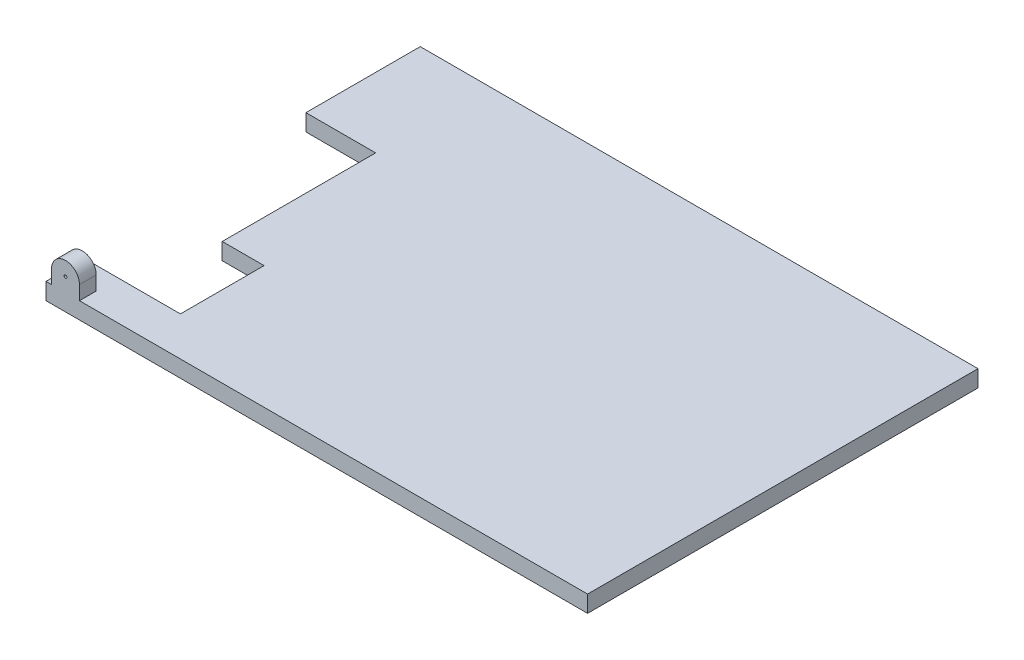
ISO-10303-21;
HEADER;
FILE_DESCRIPTION(('STEP AP214'),'2;1');
FILE_NAME('part.step','',(''),(''),'','','');
FILE_SCHEMA(('AUTOMOTIVE_DESIGN { 1 0 10303 214 1 1 1 1 }'));
ENDSEC;
DATA;
#1=APPLICATION_CONTEXT('core data for automotive mechanical design processes');
#2=APPLICATION_PROTOCOL_DEFINITION('international standard','automotive_design',2000,#1);
#3=PRODUCT_CONTEXT('',#1,'mechanical');
#4=PRODUCT('Part','Part','',(#3));
#5=PRODUCT_RELATED_PRODUCT_CATEGORY('part','',(#4));
#6=PRODUCT_DEFINITION_FORMATION('','',#4);
#7=PRODUCT_DEFINITION_CONTEXT('part definition',#1,'design');
#8=PRODUCT_DEFINITION('design','',#6,#7);
#9=PRODUCT_DEFINITION_SHAPE('','',#8);
#10=(LENGTH_UNIT() NAMED_UNIT(*) SI_UNIT(.MILLI.,.METRE.));
#11=(NAMED_UNIT(*) PLANE_ANGLE_UNIT() SI_UNIT($,.RADIAN.));
#12=(NAMED_UNIT(*) SI_UNIT($,.STERADIAN.) SOLID_ANGLE_UNIT());
#13=UNCERTAINTY_MEASURE_WITH_UNIT(LENGTH_MEASURE(1.E-05),#10,'distance_accuracy_value','');
#14=(GEOMETRIC_REPRESENTATION_CONTEXT(3) GLOBAL_UNCERTAINTY_ASSIGNED_CONTEXT((#13)) GLOBAL_UNIT_ASSIGNED_CONTEXT((#10,
#11,#12)) REPRESENTATION_CONTEXT('',''));
#15=CARTESIAN_POINT('',(0.,0.,0.));
#16=DIRECTION('',(0.,0.,1.));
#17=DIRECTION('',(1.,0.,0.));
#18=AXIS2_PLACEMENT_3D('',#15,#16,#17);
#19=CARTESIAN_POINT('',(40.,6.,-18.7966927474291));
#20=DIRECTION('',(1.,0.,0.));
#21=DIRECTION('',(0.,0.,-1.));
#22=AXIS2_PLACEMENT_3D('',#19,#20,#21);
#23=PLANE('',#22);
#24=DIRECTION('',(0.,0.,1.));
#25=VECTOR('',#24,1.);
#26=CARTESIAN_POINT('',(40.,0.,-18.7966927474291));
#27=LINE('',#26,#25);
#28=CARTESIAN_POINT('',(40.,0.,-48.7966927474291));
#29=VERTEX_POINT('',#28);
#30=CARTESIAN_POINT('',(40.,0.,-18.7966927474291));
#31=VERTEX_POINT('',#30);
#32=EDGE_CURVE('E155',#29,#31,#27,.T.);
#33=ORIENTED_EDGE('',*,*,#32,.T.);
#34=DIRECTION('',(0.,-1.,0.));
#35=VECTOR('',#34,1.);
#36=CARTESIAN_POINT('',(40.,6.,-18.7966927474291));
#37=LINE('',#36,#35);
#38=CARTESIAN_POINT('',(40.,6.,-18.7966927474291));
#39=VERTEX_POINT('',#38);
#40=EDGE_CURVE('E11',#39,#31,#37,.T.);
#41=ORIENTED_EDGE('',*,*,#40,.F.);
#42=DIRECTION('',(0.,0.,1.));
#43=VECTOR('',#42,1.);
#44=CARTESIAN_POINT('',(40.,6.,-18.7966927474291));
#45=LINE('',#44,#43);
#46=CARTESIAN_POINT('',(40.,6.,-48.7966927474291));
#47=VERTEX_POINT('',#46);
#48=EDGE_CURVE('E176',#47,#39,#45,.T.);
#49=ORIENTED_EDGE('',*,*,#48,.F.);
#50=DIRECTION('',(0.,-1.,0.));
#51=VECTOR('',#50,1.);
#52=CARTESIAN_POINT('',(40.,6.,-48.7966927474291));
#53=LINE('',#52,#51);
#54=EDGE_CURVE('E151',#47,#29,#53,.T.);
#55=ORIENTED_EDGE('',*,*,#54,.T.);
#56=EDGE_LOOP('',(#33,#41,#49,#55));
#57=FACE_BOUND('',#56,.T.);
#58=ADVANCED_FACE('F32',(#57),#23,.F.);
#59=CARTESIAN_POINT('',(5.80436578559797,6.,-18.7966927474291));
#60=DIRECTION('',(0.,0.,1.));
#61=DIRECTION('',(1.,0.,0.));
#62=AXIS2_PLACEMENT_3D('',#59,#60,#61);
#63=PLANE('',#62);
#64=DIRECTION('',(-1.,0.,0.));
#65=VECTOR('',#64,1.);
#66=CARTESIAN_POINT('',(5.80436578559797,0.,-18.7966927474291));
#67=LINE('',#66,#65);
#68=CARTESIAN_POINT('',(5.80436578559797,0.,-18.7966927474291));
#69=VERTEX_POINT('',#68);
#70=EDGE_CURVE('E158',#31,#69,#67,.T.);
#71=ORIENTED_EDGE('',*,*,#70,.T.);
#72=DIRECTION('',(0.,-1.,0.));
#73=VECTOR('',#72,1.);
#74=CARTESIAN_POINT('',(5.80436578559797,6.,-18.7966927474291));
#75=LINE('',#74,#73);
#76=CARTESIAN_POINT('',(5.80436578559797,6.,-18.7966927474291));
#77=VERTEX_POINT('',#76);
#78=EDGE_CURVE('E40',#77,#69,#75,.T.);
#79=ORIENTED_EDGE('',*,*,#78,.F.);
#80=DIRECTION('',(-1.,0.,0.));
#81=VECTOR('',#80,1.);
#82=CARTESIAN_POINT('',(25.,6.,-18.7966927474291));
#83=LINE('',#82,#81);
#84=EDGE_CURVE('E104',#39,#77,#83,.T.);
#85=ORIENTED_EDGE('',*,*,#84,.F.);
#86=ORIENTED_EDGE('',*,*,#40,.T.);
#87=EDGE_LOOP('',(#71,#79,#85,#86));
#88=FACE_BOUND('',#87,.T.);
#89=ADVANCED_FACE('F298',(#88),#63,.F.);
#90=CARTESIAN_POINT('',(5.80436578559797,6.,-4.79669274742911));
#91=DIRECTION('',(1.,0.,0.));
#92=DIRECTION('',(0.,0.,-1.));
#93=AXIS2_PLACEMENT_3D('',#90,#91,#92);
#94=PLANE('',#93);
#95=DIRECTION('',(0.,0.,1.));
#96=VECTOR('',#95,1.);
#97=CARTESIAN_POINT('',(5.80436578559797,0.,-4.79669274742911));
#98=LINE('',#97,#96);
#99=CARTESIAN_POINT('',(5.80436578559797,0.,-4.79669274742911));
#100=VERTEX_POINT('',#99);
#101=EDGE_CURVE('E162',#69,#100,#98,.T.);
#102=ORIENTED_EDGE('',*,*,#101,.T.);
#103=DIRECTION('',(0.,-1.,0.));
#104=VECTOR('',#103,1.);
#105=CARTESIAN_POINT('',(5.80436578559797,6.,-4.79669274742911));
#106=LINE('',#105,#104);
#107=CARTESIAN_POINT('',(5.80436578559797,6.,-4.79669274742911));
#108=VERTEX_POINT('',#107);
#109=EDGE_CURVE('E189',#108,#100,#106,.T.);
#110=ORIENTED_EDGE('',*,*,#109,.F.);
#111=DIRECTION('',(0.,0.,1.));
#112=VECTOR('',#111,1.);
#113=CARTESIAN_POINT('',(5.80436578559797,6.,-10.7966927474291));
#114=LINE('',#113,#112);
#115=EDGE_CURVE('E204',#77,#108,#114,.T.);
#116=ORIENTED_EDGE('',*,*,#115,.F.);
#117=ORIENTED_EDGE('',*,*,#78,.T.);
#118=EDGE_LOOP('',(#102,#110,#116,#117));
#119=FACE_BOUND('',#118,.T.);
#120=ADVANCED_FACE('F302',(#119),#94,.F.);
#121=CARTESIAN_POINT('',(5.80436578559797,6.,-4.79669274742911));
#122=DIRECTION('',(0.,0.,-1.));
#123=DIRECTION('',(-1.,0.,0.));
#124=AXIS2_PLACEMENT_3D('',#121,#122,#123);
#125=PLANE('',#124);
#126=DIRECTION('',(1.,0.,0.));
#127=VECTOR('',#126,1.);
#128=CARTESIAN_POINT('',(5.80436578559797,0.,-4.79669274742911));
#129=LINE('',#128,#127);
#130=CARTESIAN_POINT('',(200.,0.,-4.7966927474291));
#131=VERTEX_POINT('',#130);
#132=EDGE_CURVE('E164',#100,#131,#129,.T.);
#133=ORIENTED_EDGE('',*,*,#132,.T.);
#134=DIRECTION('',(0.,-1.,0.));
#135=VECTOR('',#134,1.);
#136=CARTESIAN_POINT('',(200.,6.,-4.7966927474291));
#137=LINE('',#136,#135);
#138=CARTESIAN_POINT('',(200.,6.,-4.7966927474291));
#139=VERTEX_POINT('',#138);
#140=EDGE_CURVE('E186',#139,#131,#137,.T.);
#141=ORIENTED_EDGE('',*,*,#140,.F.);
#142=DIRECTION('',(1.,0.,0.));
#143=VECTOR('',#142,1.);
#144=CARTESIAN_POINT('',(5.80436578559797,6.,-4.79669274742911));
#145=LINE('',#144,#143);
#146=CARTESIAN_POINT('',(17.804365785598,6.,-4.79669274742911));
#147=VERTEX_POINT('',#146);
#148=EDGE_CURVE('E199',#147,#139,#145,.T.);
#149=ORIENTED_EDGE('',*,*,#148,.F.);
#150=DIRECTION('',(0.,1.,0.));
#151=VECTOR('',#150,1.);
#152=CARTESIAN_POINT('',(17.804365785598,6.,-4.79669274742911));
#153=LINE('',#152,#151);
#154=CARTESIAN_POINT('',(17.804365785598,11.,-4.79669274742911));
#155=VERTEX_POINT('',#154);
#156=EDGE_CURVE('E48',#147,#155,#153,.T.);
#157=ORIENTED_EDGE('',*,*,#156,.T.);
#158=CARTESIAN_POINT('',(12.804365785598,11.,-4.79669274742911));
#159=DIRECTION('',(0.,0.,1.));
#160=DIRECTION('',(1.,0.,0.));
#161=AXIS2_PLACEMENT_3D('',#158,#159,#160);
#162=CIRCLE('',#161,5.);
#163=CARTESIAN_POINT('',(7.80436578559797,11.,-4.79669274742911));
#164=VERTEX_POINT('',#163);
#165=EDGE_CURVE('E250',#155,#164,#162,.T.);
#166=ORIENTED_EDGE('',*,*,#165,.T.);
#167=DIRECTION('',(0.,-1.,0.));
#168=VECTOR('',#167,1.);
#169=CARTESIAN_POINT('',(7.80436578559797,6.,-4.79669274742911));
#170=LINE('',#169,#168);
#171=CARTESIAN_POINT('',(7.80436578559797,6.,-4.79669274742911));
#172=VERTEX_POINT('',#171);
#173=EDGE_CURVE('E242',#164,#172,#170,.T.);
#174=ORIENTED_EDGE('',*,*,#173,.T.);
#175=EDGE_CURVE('E194',#108,#172,#145,.T.);
#176=ORIENTED_EDGE('',*,*,#175,.F.);
#177=ORIENTED_EDGE('',*,*,#109,.T.);
#178=EDGE_LOOP('',(#133,#141,#149,#157,#166,#174,#176,#177));
#179=FACE_BOUND('',#178,.T.);
#180=CARTESIAN_POINT('',(12.804365785598,11.,-4.79669274742911));
#181=DIRECTION('',(0.,0.,1.));
#182=DIRECTION('',(1.,0.,0.));
#183=AXIS2_PLACEMENT_3D('',#180,#181,#182);
#184=CIRCLE('',#183,0.500000000000001);
#185=CARTESIAN_POINT('',(13.304365785598,11.,-4.79669274742911));
#186=VERTEX_POINT('',#185);
#187=EDGE_CURVE('E252',#186,#186,#184,.T.);
#188=ORIENTED_EDGE('',*,*,#187,.F.);
#189=EDGE_LOOP('',(#188));
#190=FACE_BOUND('',#189,.T.);
#191=ADVANCED_FACE('F281',(#179,#190),#125,.F.);
#192=CARTESIAN_POINT('',(200.,6.,-4.7966927474291));
#193=DIRECTION('',(-1.,0.,0.));
#194=DIRECTION('',(0.,0.,1.));
#195=AXIS2_PLACEMENT_3D('',#192,#193,#194);
#196=PLANE('',#195);
#197=DIRECTION('',(0.,0.,-1.));
#198=VECTOR('',#197,1.);
#199=CARTESIAN_POINT('',(200.,0.,-4.7966927474291));
#200=LINE('',#199,#198);
#201=CARTESIAN_POINT('',(200.,0.,-144.796692747429));
#202=VERTEX_POINT('',#201);
#203=EDGE_CURVE('E166',#131,#202,#200,.T.);
#204=ORIENTED_EDGE('',*,*,#203,.T.);
#205=DIRECTION('',(0.,-1.,0.));
#206=VECTOR('',#205,1.);
#207=CARTESIAN_POINT('',(200.,6.,-144.796692747429));
#208=LINE('',#207,#206);
#209=CARTESIAN_POINT('',(200.,6.,-144.796692747429));
#210=VERTEX_POINT('',#209);
#211=EDGE_CURVE('E183',#210,#202,#208,.T.);
#212=ORIENTED_EDGE('',*,*,#211,.F.);
#213=DIRECTION('',(0.,0.,-1.));
#214=VECTOR('',#213,1.);
#215=CARTESIAN_POINT('',(200.,6.,-4.7966927474291));
#216=LINE('',#215,#214);
#217=EDGE_CURVE('E198',#139,#210,#216,.T.);
#218=ORIENTED_EDGE('',*,*,#217,.F.);
#219=ORIENTED_EDGE('',*,*,#140,.T.);
#220=EDGE_LOOP('',(#204,#212,#218,#219));
#221=FACE_BOUND('',#220,.T.);
#222=ADVANCED_FACE('F311',(#221),#196,.F.);
#223=CARTESIAN_POINT('',(0.,6.,-144.796692747429));
#224=DIRECTION('',(0.,0.,1.));
#225=DIRECTION('',(1.,0.,0.));
#226=AXIS2_PLACEMENT_3D('',#223,#224,#225);
#227=PLANE('',#226);
#228=DIRECTION('',(-1.,0.,0.));
#229=VECTOR('',#228,1.);
#230=CARTESIAN_POINT('',(0.,0.,-144.796692747429));
#231=LINE('',#230,#229);
#232=CARTESIAN_POINT('',(0.,0.,-144.796692747429));
#233=VERTEX_POINT('',#232);
#234=EDGE_CURVE('E168',#202,#233,#231,.T.);
#235=ORIENTED_EDGE('',*,*,#234,.T.);
#236=DIRECTION('',(0.,-1.,0.));
#237=VECTOR('',#236,1.);
#238=CARTESIAN_POINT('',(0.,6.,-144.796692747429));
#239=LINE('',#238,#237);
#240=CARTESIAN_POINT('',(0.,6.,-144.796692747429));
#241=VERTEX_POINT('',#240);
#242=EDGE_CURVE('E180',#241,#233,#239,.T.);
#243=ORIENTED_EDGE('',*,*,#242,.F.);
#244=DIRECTION('',(-1.,0.,0.));
#245=VECTOR('',#244,1.);
#246=CARTESIAN_POINT('',(0.,6.,-144.796692747429));
#247=LINE('',#246,#245);
#248=EDGE_CURVE('E208',#210,#241,#247,.T.);
#249=ORIENTED_EDGE('',*,*,#248,.F.);
#250=ORIENTED_EDGE('',*,*,#211,.T.);
#251=EDGE_LOOP('',(#235,#243,#249,#250));
#252=FACE_BOUND('',#251,.T.);
#253=ADVANCED_FACE('F214',(#252),#227,.F.);
#254=CARTESIAN_POINT('',(0.,6.,-103.796692747429));
#255=DIRECTION('',(1.,0.,0.));
#256=DIRECTION('',(0.,0.,-1.));
#257=AXIS2_PLACEMENT_3D('',#254,#255,#256);
#258=PLANE('',#257);
#259=DIRECTION('',(0.,0.,1.));
#260=VECTOR('',#259,1.);
#261=CARTESIAN_POINT('',(0.,0.,-103.796692747429));
#262=LINE('',#261,#260);
#263=CARTESIAN_POINT('',(0.,0.,-103.796692747429));
#264=VERTEX_POINT('',#263);
#265=EDGE_CURVE('E170',#233,#264,#262,.T.);
#266=ORIENTED_EDGE('',*,*,#265,.T.);
#267=DIRECTION('',(0.,-1.,0.));
#268=VECTOR('',#267,1.);
#269=CARTESIAN_POINT('',(0.,6.,-103.796692747429));
#270=LINE('',#269,#268);
#271=CARTESIAN_POINT('',(0.,6.,-103.796692747429));
#272=VERTEX_POINT('',#271);
#273=EDGE_CURVE('E146',#272,#264,#270,.T.);
#274=ORIENTED_EDGE('',*,*,#273,.F.);
#275=DIRECTION('',(0.,0.,1.));
#276=VECTOR('',#275,1.);
#277=CARTESIAN_POINT('',(0.,6.,-103.796692747429));
#278=LINE('',#277,#276);
#279=EDGE_CURVE('E134',#241,#272,#278,.T.);
#280=ORIENTED_EDGE('',*,*,#279,.F.);
#281=ORIENTED_EDGE('',*,*,#242,.T.);
#282=EDGE_LOOP('',(#266,#274,#280,#281));
#283=FACE_BOUND('',#282,.T.);
#284=ADVANCED_FACE('F218',(#283),#258,.F.);
#285=CARTESIAN_POINT('',(25.,6.,-103.796692747429));
#286=DIRECTION('',(0.,0.,-1.));
#287=DIRECTION('',(-1.,0.,0.));
#288=AXIS2_PLACEMENT_3D('',#285,#286,#287);
#289=PLANE('',#288);
#290=DIRECTION('',(1.,0.,0.));
#291=VECTOR('',#290,1.);
#292=CARTESIAN_POINT('',(25.,0.,-103.796692747429));
#293=LINE('',#292,#291);
#294=CARTESIAN_POINT('',(25.,0.,-103.796692747429));
#295=VERTEX_POINT('',#294);
#296=EDGE_CURVE('E143',#264,#295,#293,.T.);
#297=ORIENTED_EDGE('',*,*,#296,.T.);
#298=DIRECTION('',(0.,-1.,0.));
#299=VECTOR('',#298,1.);
#300=CARTESIAN_POINT('',(25.,6.,-103.796692747429));
#301=LINE('',#300,#299);
#302=CARTESIAN_POINT('',(25.,6.,-103.796692747429));
#303=VERTEX_POINT('',#302);
#304=EDGE_CURVE('E140',#303,#295,#301,.T.);
#305=ORIENTED_EDGE('',*,*,#304,.F.);
#306=DIRECTION('',(1.,0.,0.));
#307=VECTOR('',#306,1.);
#308=CARTESIAN_POINT('',(25.,6.,-103.796692747429));
#309=LINE('',#308,#307);
#310=EDGE_CURVE('E126',#272,#303,#309,.T.);
#311=ORIENTED_EDGE('',*,*,#310,.F.);
#312=ORIENTED_EDGE('',*,*,#273,.T.);
#313=EDGE_LOOP('',(#297,#305,#311,#312));
#314=FACE_BOUND('',#313,.T.);
#315=ADVANCED_FACE('F141',(#314),#289,.F.);
#316=CARTESIAN_POINT('',(25.,6.,-48.7966927474291));
#317=DIRECTION('',(1.,0.,0.));
#318=DIRECTION('',(0.,0.,-1.));
#319=AXIS2_PLACEMENT_3D('',#316,#317,#318);
#320=PLANE('',#319);
#321=DIRECTION('',(0.,0.,1.));
#322=VECTOR('',#321,1.);
#323=CARTESIAN_POINT('',(25.,0.,-48.7966927474291));
#324=LINE('',#323,#322);
#325=CARTESIAN_POINT('',(25.,0.,-48.7966927474291));
#326=VERTEX_POINT('',#325);
#327=EDGE_CURVE('E173',#295,#326,#324,.T.);
#328=ORIENTED_EDGE('',*,*,#327,.T.);
#329=DIRECTION('',(0.,-1.,0.));
#330=VECTOR('',#329,1.);
#331=CARTESIAN_POINT('',(25.,6.,-48.7966927474291));
#332=LINE('',#331,#330);
#333=CARTESIAN_POINT('',(25.,6.,-48.7966927474291));
#334=VERTEX_POINT('',#333);
#335=EDGE_CURVE('E147',#334,#326,#332,.T.);
#336=ORIENTED_EDGE('',*,*,#335,.F.);
#337=DIRECTION('',(0.,0.,1.));
#338=VECTOR('',#337,1.);
#339=CARTESIAN_POINT('',(25.,6.,-48.7966927474291));
#340=LINE('',#339,#338);
#341=EDGE_CURVE('E131',#303,#334,#340,.T.);
#342=ORIENTED_EDGE('',*,*,#341,.F.);
#343=ORIENTED_EDGE('',*,*,#304,.T.);
#344=EDGE_LOOP('',(#328,#336,#342,#343));
#345=FACE_BOUND('',#344,.T.);
#346=ADVANCED_FACE('F149',(#345),#320,.F.);
#347=CARTESIAN_POINT('',(40.,6.,-48.7966927474291));
#348=DIRECTION('',(0.,0.,-1.));
#349=DIRECTION('',(-1.,0.,0.));
#350=AXIS2_PLACEMENT_3D('',#347,#348,#349);
#351=PLANE('',#350);
#352=DIRECTION('',(1.,0.,0.));
#353=VECTOR('',#352,1.);
#354=CARTESIAN_POINT('',(40.,0.,-48.7966927474291));
#355=LINE('',#354,#353);
#356=EDGE_CURVE('E96',#326,#29,#355,.T.);
#357=ORIENTED_EDGE('',*,*,#356,.T.);
#358=ORIENTED_EDGE('',*,*,#54,.F.);
#359=DIRECTION('',(1.,0.,0.));
#360=VECTOR('',#359,1.);
#361=CARTESIAN_POINT('',(40.,6.,-48.7966927474291));
#362=LINE('',#361,#360);
#363=EDGE_CURVE('E57',#334,#47,#362,.T.);
#364=ORIENTED_EDGE('',*,*,#363,.F.);
#365=ORIENTED_EDGE('',*,*,#335,.T.);
#366=EDGE_LOOP('',(#357,#358,#364,#365));
#367=FACE_BOUND('',#366,.T.);
#368=ADVANCED_FACE('F222',(#367),#351,.F.);
#369=CARTESIAN_POINT('',(0.,6.,0.));
#370=DIRECTION('',(0.,1.,0.));
#371=DIRECTION('',(0.,0.,1.));
#372=AXIS2_PLACEMENT_3D('',#369,#370,#371);
#373=PLANE('',#372);
#374=DIRECTION('',(0.,0.,1.));
#375=VECTOR('',#374,1.);
#376=CARTESIAN_POINT('',(7.80436578559797,6.,-10.7966927474291));
#377=LINE('',#376,#375);
#378=CARTESIAN_POINT('',(7.80436578559797,6.,-10.7966927474291));
#379=VERTEX_POINT('',#378);
#380=EDGE_CURVE('E236',#379,#172,#377,.T.);
#381=ORIENTED_EDGE('',*,*,#380,.F.);
#382=DIRECTION('',(1.,0.,0.));
#383=VECTOR('',#382,1.);
#384=CARTESIAN_POINT('',(7.80436578559797,6.,-10.7966927474291));
#385=LINE('',#384,#383);
#386=CARTESIAN_POINT('',(17.804365785598,6.,-10.7966927474291));
#387=VERTEX_POINT('',#386);
#388=EDGE_CURVE('E262',#379,#387,#385,.T.);
#389=ORIENTED_EDGE('',*,*,#388,.T.);
#390=DIRECTION('',(0.,0.,1.));
#391=VECTOR('',#390,1.);
#392=CARTESIAN_POINT('',(17.804365785598,6.,-10.7966927474291));
#393=LINE('',#392,#391);
#394=EDGE_CURVE('E233',#387,#147,#393,.T.);
#395=ORIENTED_EDGE('',*,*,#394,.T.);
#396=ORIENTED_EDGE('',*,*,#148,.T.);
#397=ORIENTED_EDGE('',*,*,#217,.T.);
#398=ORIENTED_EDGE('',*,*,#248,.T.);
#399=ORIENTED_EDGE('',*,*,#279,.T.);
#400=ORIENTED_EDGE('',*,*,#310,.T.);
#401=ORIENTED_EDGE('',*,*,#341,.T.);
#402=ORIENTED_EDGE('',*,*,#363,.T.);
#403=ORIENTED_EDGE('',*,*,#48,.T.);
#404=ORIENTED_EDGE('',*,*,#84,.T.);
#405=ORIENTED_EDGE('',*,*,#115,.T.);
#406=ORIENTED_EDGE('',*,*,#175,.T.);
#407=EDGE_LOOP('',(#381,#389,#395,#396,#397,#398,#399,#400,#401,#402,#403,#404,#405,#406));
#408=FACE_BOUND('',#407,.T.);
#409=ADVANCED_FACE('F129',(#408),#373,.T.);
#410=CARTESIAN_POINT('',(0.,0.,0.));
#411=DIRECTION('',(0.,1.,0.));
#412=DIRECTION('',(0.,0.,1.));
#413=AXIS2_PLACEMENT_3D('',#410,#411,#412);
#414=PLANE('',#413);
#415=ORIENTED_EDGE('',*,*,#32,.F.);
#416=ORIENTED_EDGE('',*,*,#356,.F.);
#417=ORIENTED_EDGE('',*,*,#327,.F.);
#418=ORIENTED_EDGE('',*,*,#296,.F.);
#419=ORIENTED_EDGE('',*,*,#265,.F.);
#420=ORIENTED_EDGE('',*,*,#234,.F.);
#421=ORIENTED_EDGE('',*,*,#203,.F.);
#422=ORIENTED_EDGE('',*,*,#132,.F.);
#423=ORIENTED_EDGE('',*,*,#101,.F.);
#424=ORIENTED_EDGE('',*,*,#70,.F.);
#425=EDGE_LOOP('',(#415,#416,#417,#418,#419,#420,#421,#422,#423,#424));
#426=FACE_BOUND('',#425,.T.);
#427=ADVANCED_FACE('F221',(#426),#414,.F.);
#428=CARTESIAN_POINT('',(7.80436578559797,6.,-10.7966927474291));
#429=DIRECTION('',(-1.,0.,0.));
#430=DIRECTION('',(0.,0.,1.));
#431=AXIS2_PLACEMENT_3D('',#428,#429,#430);
#432=PLANE('',#431);
#433=ORIENTED_EDGE('',*,*,#173,.F.);
#434=DIRECTION('',(0.,0.,1.));
#435=VECTOR('',#434,1.);
#436=CARTESIAN_POINT('',(7.80436578559797,11.,-10.7966927474291));
#437=LINE('',#436,#435);
#438=CARTESIAN_POINT('',(7.80436578559797,11.,-10.7966927474291));
#439=VERTEX_POINT('',#438);
#440=EDGE_CURVE('E159',#439,#164,#437,.T.);
#441=ORIENTED_EDGE('',*,*,#440,.F.);
#442=DIRECTION('',(0.,-1.,0.));
#443=VECTOR('',#442,1.);
#444=CARTESIAN_POINT('',(7.80436578559797,6.,-10.7966927474291));
#445=LINE('',#444,#443);
#446=EDGE_CURVE('E259',#439,#379,#445,.T.);
#447=ORIENTED_EDGE('',*,*,#446,.T.);
#448=ORIENTED_EDGE('',*,*,#380,.T.);
#449=EDGE_LOOP('',(#433,#441,#447,#448));
#450=FACE_BOUND('',#449,.T.);
#451=ADVANCED_FACE('F286',(#450),#432,.T.);
#452=CARTESIAN_POINT('',(12.804365785598,11.,-10.7966927474291));
#453=DIRECTION('',(0.,0.,1.));
#454=DIRECTION('',(1.,0.,0.));
#455=AXIS2_PLACEMENT_3D('',#452,#453,#454);
#456=CYLINDRICAL_SURFACE('',#455,5.);
#457=ORIENTED_EDGE('',*,*,#165,.F.);
#458=DIRECTION('',(0.,0.,1.));
#459=VECTOR('',#458,1.);
#460=CARTESIAN_POINT('',(17.804365785598,11.,-10.7966927474291));
#461=LINE('',#460,#459);
#462=CARTESIAN_POINT('',(17.804365785598,11.,-10.7966927474291));
#463=VERTEX_POINT('',#462);
#464=EDGE_CURVE('E230',#463,#155,#461,.T.);
#465=ORIENTED_EDGE('',*,*,#464,.F.);
#466=CARTESIAN_POINT('',(12.804365785598,11.,-10.7966927474291));
#467=DIRECTION('',(0.,0.,1.));
#468=DIRECTION('',(1.,0.,0.));
#469=AXIS2_PLACEMENT_3D('',#466,#467,#468);
#470=CIRCLE('',#469,5.);
#471=EDGE_CURVE('E240',#463,#439,#470,.T.);
#472=ORIENTED_EDGE('',*,*,#471,.T.);
#473=ORIENTED_EDGE('',*,*,#440,.T.);
#474=EDGE_LOOP('',(#457,#465,#472,#473));
#475=FACE_BOUND('',#474,.T.);
#476=ADVANCED_FACE('F284',(#475),#456,.T.);
#477=CARTESIAN_POINT('',(17.804365785598,6.,-10.7966927474291));
#478=DIRECTION('',(1.,0.,0.));
#479=DIRECTION('',(0.,0.,-1.));
#480=AXIS2_PLACEMENT_3D('',#477,#478,#479);
#481=PLANE('',#480);
#482=ORIENTED_EDGE('',*,*,#156,.F.);
#483=ORIENTED_EDGE('',*,*,#394,.F.);
#484=DIRECTION('',(0.,1.,0.));
#485=VECTOR('',#484,1.);
#486=CARTESIAN_POINT('',(17.804365785598,6.,-10.7966927474291));
#487=LINE('',#486,#485);
#488=EDGE_CURVE('E265',#387,#463,#487,.T.);
#489=ORIENTED_EDGE('',*,*,#488,.T.);
#490=ORIENTED_EDGE('',*,*,#464,.T.);
#491=EDGE_LOOP('',(#482,#483,#489,#490));
#492=FACE_BOUND('',#491,.T.);
#493=ADVANCED_FACE('F276',(#492),#481,.T.);
#494=CARTESIAN_POINT('',(12.804365785598,11.,-10.7966927474291));
#495=DIRECTION('',(0.,0.,1.));
#496=DIRECTION('',(1.,0.,0.));
#497=AXIS2_PLACEMENT_3D('',#494,#495,#496);
#498=PLANE('',#497);
#499=CARTESIAN_POINT('',(12.804365785598,11.,-10.7966927474291));
#500=DIRECTION('',(0.,0.,1.));
#501=DIRECTION('',(1.,0.,0.));
#502=AXIS2_PLACEMENT_3D('',#499,#500,#501);
#503=CIRCLE('',#502,0.500000000000001);
#504=CARTESIAN_POINT('',(13.304365785598,11.,-10.7966927474291));
#505=VERTEX_POINT('',#504);
#506=EDGE_CURVE('E244',#505,#505,#503,.T.);
#507=ORIENTED_EDGE('',*,*,#506,.T.);
#508=EDGE_LOOP('',(#507));
#509=FACE_BOUND('',#508,.T.);
#510=ORIENTED_EDGE('',*,*,#446,.F.);
#511=ORIENTED_EDGE('',*,*,#471,.F.);
#512=ORIENTED_EDGE('',*,*,#488,.F.);
#513=ORIENTED_EDGE('',*,*,#388,.F.);
#514=EDGE_LOOP('',(#510,#511,#512,#513));
#515=FACE_BOUND('',#514,.T.);
#516=ADVANCED_FACE('F292',(#509,#515),#498,.F.);
#517=CARTESIAN_POINT('',(12.804365785598,11.,-10.7966927474291));
#518=DIRECTION('',(0.,0.,1.));
#519=DIRECTION('',(1.,0.,0.));
#520=AXIS2_PLACEMENT_3D('',#517,#518,#519);
#521=CYLINDRICAL_SURFACE('',#520,0.500000000000001);
#522=ORIENTED_EDGE('',*,*,#506,.F.);
#523=EDGE_LOOP('',(#522));
#524=FACE_BOUND('',#523,.T.);
#525=ORIENTED_EDGE('',*,*,#187,.T.);
#526=EDGE_LOOP('',(#525));
#527=FACE_BOUND('',#526,.T.);
#528=ADVANCED_FACE('F361',(#524,#527),#521,.F.);
#529=CLOSED_SHELL('',(#58,#89,#120,#191,#222,#253,#284,#315,#346,#368,#409,#427,#451,#476,#493,
#516,#528));
#530=MANIFOLD_SOLID_BREP('B2',#529);
#531=ADVANCED_BREP_SHAPE_REPRESENTATION('',(#18,#530),#14);
#532=SHAPE_DEFINITION_REPRESENTATION(#9,#531);
ENDSEC;
END-ISO-10303-21;
